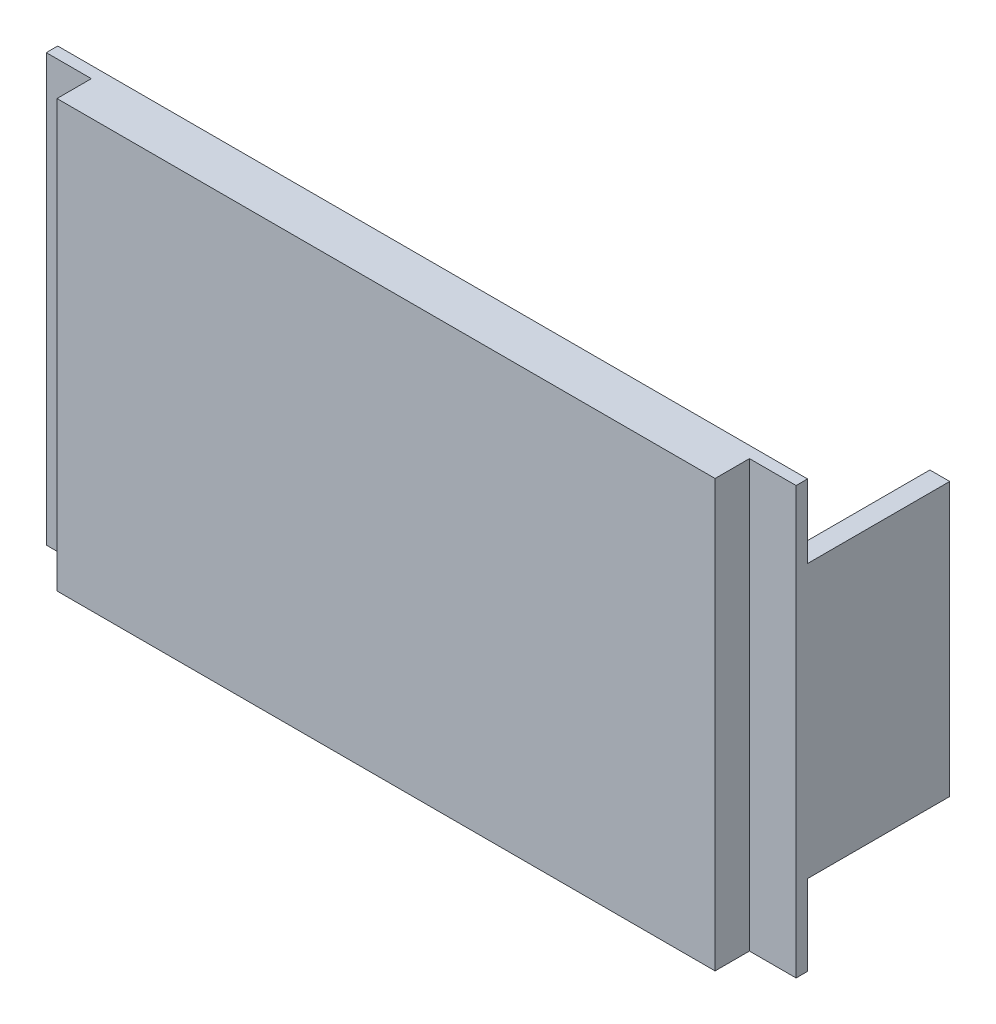
ISO-10303-21;
HEADER;
FILE_DESCRIPTION(('STEP AP214'),'2;1');
FILE_NAME('part.step','',(''),(''),'','','');
FILE_SCHEMA(('AUTOMOTIVE_DESIGN { 1 0 10303 214 1 1 1 1 }'));
ENDSEC;
DATA;
#1=APPLICATION_CONTEXT('core data for automotive mechanical design processes');
#2=APPLICATION_PROTOCOL_DEFINITION('international standard','automotive_design',2000,#1);
#3=PRODUCT_CONTEXT('',#1,'mechanical');
#4=PRODUCT('Part','Part','',(#3));
#5=PRODUCT_RELATED_PRODUCT_CATEGORY('part','',(#4));
#6=PRODUCT_DEFINITION_FORMATION('','',#4);
#7=PRODUCT_DEFINITION_CONTEXT('part definition',#1,'design');
#8=PRODUCT_DEFINITION('design','',#6,#7);
#9=PRODUCT_DEFINITION_SHAPE('','',#8);
#10=(LENGTH_UNIT() NAMED_UNIT(*) SI_UNIT(.MILLI.,.METRE.));
#11=(NAMED_UNIT(*) PLANE_ANGLE_UNIT() SI_UNIT($,.RADIAN.));
#12=(NAMED_UNIT(*) SI_UNIT($,.STERADIAN.) SOLID_ANGLE_UNIT());
#13=UNCERTAINTY_MEASURE_WITH_UNIT(LENGTH_MEASURE(1.E-05),#10,'distance_accuracy_value','');
#14=(GEOMETRIC_REPRESENTATION_CONTEXT(3) GLOBAL_UNCERTAINTY_ASSIGNED_CONTEXT((#13)) GLOBAL_UNIT_ASSIGNED_CONTEXT((#10,
#11,#12)) REPRESENTATION_CONTEXT('',''));
#15=CARTESIAN_POINT('',(0.,0.,0.));
#16=DIRECTION('',(0.,0.,1.));
#17=DIRECTION('',(1.,0.,0.));
#18=AXIS2_PLACEMENT_3D('',#15,#16,#17);
#19=CARTESIAN_POINT('',(0.,0.,0.));
#20=DIRECTION('',(0.,0.,-1.));
#21=DIRECTION('',(-1.,0.,0.));
#22=AXIS2_PLACEMENT_3D('',#19,#20,#21);
#23=PLANE('',#22);
#24=DIRECTION('',(-1.,0.,0.));
#25=VECTOR('',#24,1.);
#26=CARTESIAN_POINT('',(0.,-18.9488126975122,0.));
#27=LINE('',#26,#25);
#28=CARTESIAN_POINT('',(49.05,-18.9488126975122,0.));
#29=VERTEX_POINT('',#28);
#30=CARTESIAN_POINT('',(46.45,-18.9488126975122,0.));
#31=VERTEX_POINT('',#30);
#32=EDGE_CURVE('E209',#29,#31,#27,.T.);
#33=ORIENTED_EDGE('',*,*,#32,.F.);
#34=DIRECTION('',(0.,1.,0.));
#35=VECTOR('',#34,1.);
#36=CARTESIAN_POINT('',(49.05,-29.4610207100592,0.));
#37=LINE('',#36,#35);
#38=CARTESIAN_POINT('',(49.05,-29.4610207100592,0.));
#39=VERTEX_POINT('',#38);
#40=EDGE_CURVE('E271',#39,#29,#37,.T.);
#41=ORIENTED_EDGE('',*,*,#40,.F.);
#42=DIRECTION('',(1.,0.,0.));
#43=VECTOR('',#42,1.);
#44=CARTESIAN_POINT('',(-49.05,-29.4610207100592,0.));
#45=LINE('',#44,#43);
#46=CARTESIAN_POINT('',(-49.05,-29.4610207100592,0.));
#47=VERTEX_POINT('',#46);
#48=EDGE_CURVE('E267',#47,#39,#45,.T.);
#49=ORIENTED_EDGE('',*,*,#48,.F.);
#50=DIRECTION('',(0.,-1.,0.));
#51=VECTOR('',#50,1.);
#52=CARTESIAN_POINT('',(-49.05,-29.4610207100592,0.));
#53=LINE('',#52,#51);
#54=CARTESIAN_POINT('',(-49.05,26.3389792899408,0.));
#55=VERTEX_POINT('',#54);
#56=EDGE_CURVE('E277',#55,#47,#53,.T.);
#57=ORIENTED_EDGE('',*,*,#56,.F.);
#58=DIRECTION('',(-1.,0.,0.));
#59=VECTOR('',#58,1.);
#60=CARTESIAN_POINT('',(-49.05,26.3389792899408,0.));
#61=LINE('',#60,#59);
#62=CARTESIAN_POINT('',(49.05,26.3389792899408,0.));
#63=VERTEX_POINT('',#62);
#64=EDGE_CURVE('E274',#63,#55,#61,.T.);
#65=ORIENTED_EDGE('',*,*,#64,.F.);
#66=CARTESIAN_POINT('',(49.05,16.7511873024878,0.));
#67=VERTEX_POINT('',#66);
#68=EDGE_CURVE('E246',#67,#63,#37,.T.);
#69=ORIENTED_EDGE('',*,*,#68,.F.);
#70=DIRECTION('',(-1.,0.,0.));
#71=VECTOR('',#70,1.);
#72=CARTESIAN_POINT('',(0.,16.7511873024878,0.));
#73=LINE('',#72,#71);
#74=CARTESIAN_POINT('',(46.45,16.7511873024878,0.));
#75=VERTEX_POINT('',#74);
#76=EDGE_CURVE('E200',#67,#75,#73,.T.);
#77=ORIENTED_EDGE('',*,*,#76,.T.);
#78=DIRECTION('',(0.,-1.,0.));
#79=VECTOR('',#78,1.);
#80=CARTESIAN_POINT('',(46.45,0.,0.));
#81=LINE('',#80,#79);
#82=EDGE_CURVE('E84',#75,#31,#81,.T.);
#83=ORIENTED_EDGE('',*,*,#82,.T.);
#84=EDGE_LOOP('',(#33,#41,#49,#57,#65,#69,#77,#83));
#85=FACE_BOUND('',#84,.T.);
#86=DIRECTION('',(-1.,0.,0.));
#87=VECTOR('',#86,1.);
#88=CARTESIAN_POINT('',(4.84999999999999,-27.8610207100592,0.));
#89=LINE('',#88,#87);
#90=CARTESIAN_POINT('',(4.84999999999999,-27.8610207100592,0.));
#91=VERTEX_POINT('',#90);
#92=CARTESIAN_POINT('',(-9.95000000000001,-27.8610207100592,0.));
#93=VERTEX_POINT('',#92);
#94=EDGE_CURVE('E444',#91,#93,#89,.T.);
#95=ORIENTED_EDGE('',*,*,#94,.F.);
#96=DIRECTION('',(0.,-1.,0.));
#97=VECTOR('',#96,1.);
#98=CARTESIAN_POINT('',(4.84999999999999,-13.1610207100592,0.));
#99=LINE('',#98,#97);
#100=CARTESIAN_POINT('',(4.84999999999999,-13.1610207100592,0.));
#101=VERTEX_POINT('',#100);
#102=EDGE_CURVE('E197',#101,#91,#99,.T.);
#103=ORIENTED_EDGE('',*,*,#102,.F.);
#104=DIRECTION('',(1.,0.,0.));
#105=VECTOR('',#104,1.);
#106=CARTESIAN_POINT('',(4.84999999999999,-13.1610207100592,0.));
#107=LINE('',#106,#105);
#108=CARTESIAN_POINT('',(-9.95000000000001,-13.1610207100592,0.));
#109=VERTEX_POINT('',#108);
#110=EDGE_CURVE('E193',#109,#101,#107,.T.);
#111=ORIENTED_EDGE('',*,*,#110,.F.);
#112=DIRECTION('',(0.,1.,0.));
#113=VECTOR('',#112,1.);
#114=CARTESIAN_POINT('',(-9.95000000000001,-13.1610207100592,0.));
#115=LINE('',#114,#113);
#116=EDGE_CURVE('E441',#93,#109,#115,.T.);
#117=ORIENTED_EDGE('',*,*,#116,.F.);
#118=EDGE_LOOP('',(#95,#103,#111,#117));
#119=FACE_BOUND('',#118,.T.);
#120=ADVANCED_FACE('F61',(#85,#119),#23,.T.);
#121=CARTESIAN_POINT('',(-49.05,-29.4610207100592,6.));
#122=DIRECTION('',(1.,0.,0.));
#123=DIRECTION('',(0.,0.,-1.));
#124=AXIS2_PLACEMENT_3D('',#121,#122,#123);
#125=PLANE('',#124);
#126=DIRECTION('',(0.,-1.,0.));
#127=VECTOR('',#126,1.);
#128=CARTESIAN_POINT('',(-49.05,26.3389792899408,1.5));
#129=LINE('',#128,#127);
#130=CARTESIAN_POINT('',(-49.05,26.3389792899408,1.5));
#131=VERTEX_POINT('',#130);
#132=CARTESIAN_POINT('',(-49.05,-29.4610207100592,1.5));
#133=VERTEX_POINT('',#132);
#134=EDGE_CURVE('E229',#131,#133,#129,.T.);
#135=ORIENTED_EDGE('',*,*,#134,.F.);
#136=DIRECTION('',(0.,0.,-1.));
#137=VECTOR('',#136,1.);
#138=CARTESIAN_POINT('',(-49.05,26.3389792899408,6.));
#139=LINE('',#138,#137);
#140=EDGE_CURVE('E69',#131,#55,#139,.T.);
#141=ORIENTED_EDGE('',*,*,#140,.T.);
#142=ORIENTED_EDGE('',*,*,#56,.T.);
#143=DIRECTION('',(0.,0.,-1.));
#144=VECTOR('',#143,1.);
#145=CARTESIAN_POINT('',(-49.05,-29.4610207100592,6.));
#146=LINE('',#145,#144);
#147=EDGE_CURVE('E283',#133,#47,#146,.T.);
#148=ORIENTED_EDGE('',*,*,#147,.F.);
#149=EDGE_LOOP('',(#135,#141,#142,#148));
#150=FACE_BOUND('',#149,.T.);
#151=ADVANCED_FACE('F287',(#150),#125,.F.);
#152=CARTESIAN_POINT('',(49.05,-29.4610207100592,6.));
#153=DIRECTION('',(-1.,0.,0.));
#154=DIRECTION('',(0.,0.,1.));
#155=AXIS2_PLACEMENT_3D('',#152,#153,#154);
#156=PLANE('',#155);
#157=DIRECTION('',(0.,0.,-1.));
#158=VECTOR('',#157,1.);
#159=CARTESIAN_POINT('',(49.05,26.3389792899408,6.));
#160=LINE('',#159,#158);
#161=CARTESIAN_POINT('',(49.05,26.3389792899408,1.5));
#162=VERTEX_POINT('',#161);
#163=EDGE_CURVE('E13',#162,#63,#160,.T.);
#164=ORIENTED_EDGE('',*,*,#163,.F.);
#165=DIRECTION('',(0.,1.,0.));
#166=VECTOR('',#165,1.);
#167=CARTESIAN_POINT('',(49.05,26.3389792899408,1.5));
#168=LINE('',#167,#166);
#169=CARTESIAN_POINT('',(49.05,-29.4610207100592,1.5));
#170=VERTEX_POINT('',#169);
#171=EDGE_CURVE('E248',#170,#162,#168,.T.);
#172=ORIENTED_EDGE('',*,*,#171,.F.);
#173=DIRECTION('',(0.,0.,-1.));
#174=VECTOR('',#173,1.);
#175=CARTESIAN_POINT('',(49.05,-29.4610207100592,6.));
#176=LINE('',#175,#174);
#177=EDGE_CURVE('E270',#170,#39,#176,.T.);
#178=ORIENTED_EDGE('',*,*,#177,.T.);
#179=ORIENTED_EDGE('',*,*,#40,.T.);
#180=DIRECTION('',(0.,0.,1.));
#181=VECTOR('',#180,1.);
#182=CARTESIAN_POINT('',(49.05,-18.9488126975122,-18.6));
#183=LINE('',#182,#181);
#184=CARTESIAN_POINT('',(49.05,-18.9488126975122,-18.6));
#185=VERTEX_POINT('',#184);
#186=EDGE_CURVE('E222',#185,#29,#183,.T.);
#187=ORIENTED_EDGE('',*,*,#186,.F.);
#188=DIRECTION('',(0.,-1.,0.));
#189=VECTOR('',#188,1.);
#190=CARTESIAN_POINT('',(49.05,0.,-18.6));
#191=LINE('',#190,#189);
#192=CARTESIAN_POINT('',(49.05,16.7511873024878,-18.6));
#193=VERTEX_POINT('',#192);
#194=EDGE_CURVE('E212',#193,#185,#191,.T.);
#195=ORIENTED_EDGE('',*,*,#194,.F.);
#196=DIRECTION('',(0.,0.,1.));
#197=VECTOR('',#196,1.);
#198=CARTESIAN_POINT('',(49.05,16.7511873024878,-18.6));
#199=LINE('',#198,#197);
#200=EDGE_CURVE('E224',#193,#67,#199,.T.);
#201=ORIENTED_EDGE('',*,*,#200,.T.);
#202=ORIENTED_EDGE('',*,*,#68,.T.);
#203=EDGE_LOOP('',(#164,#172,#178,#179,#187,#195,#201,#202));
#204=FACE_BOUND('',#203,.T.);
#205=ADVANCED_FACE('F63',(#204),#156,.F.);
#206=CARTESIAN_POINT('',(-49.05,26.3389792899408,6.));
#207=DIRECTION('',(0.,-1.,0.));
#208=DIRECTION('',(0.,0.,-1.));
#209=AXIS2_PLACEMENT_3D('',#206,#207,#208);
#210=PLANE('',#209);
#211=DIRECTION('',(-1.,0.,0.));
#212=VECTOR('',#211,1.);
#213=CARTESIAN_POINT('',(-49.05,26.3389792899408,1.5));
#214=LINE('',#213,#212);
#215=CARTESIAN_POINT('',(-43.15,26.3389792899408,1.5));
#216=VERTEX_POINT('',#215);
#217=EDGE_CURVE('E238',#216,#131,#214,.T.);
#218=ORIENTED_EDGE('',*,*,#217,.F.);
#219=DIRECTION('',(0.,0.,1.));
#220=VECTOR('',#219,1.);
#221=CARTESIAN_POINT('',(-43.15,26.3389792899408,1.5));
#222=LINE('',#221,#220);
#223=CARTESIAN_POINT('',(-43.15,26.3389792899408,6.));
#224=VERTEX_POINT('',#223);
#225=EDGE_CURVE('E243',#216,#224,#222,.T.);
#226=ORIENTED_EDGE('',*,*,#225,.T.);
#227=DIRECTION('',(-1.,0.,0.));
#228=VECTOR('',#227,1.);
#229=CARTESIAN_POINT('',(-49.05,26.3389792899408,6.));
#230=LINE('',#229,#228);
#231=CARTESIAN_POINT('',(42.95,26.3389792899408,6.));
#232=VERTEX_POINT('',#231);
#233=EDGE_CURVE('E263',#232,#224,#230,.T.);
#234=ORIENTED_EDGE('',*,*,#233,.F.);
#235=DIRECTION('',(0.,0.,1.));
#236=VECTOR('',#235,1.);
#237=CARTESIAN_POINT('',(42.95,26.3389792899408,1.5));
#238=LINE('',#237,#236);
#239=CARTESIAN_POINT('',(42.95,26.3389792899408,1.5));
#240=VERTEX_POINT('',#239);
#241=EDGE_CURVE('E258',#240,#232,#238,.T.);
#242=ORIENTED_EDGE('',*,*,#241,.F.);
#243=DIRECTION('',(-1.,0.,0.));
#244=VECTOR('',#243,1.);
#245=CARTESIAN_POINT('',(49.05,26.3389792899408,1.5));
#246=LINE('',#245,#244);
#247=EDGE_CURVE('E250',#162,#240,#246,.T.);
#248=ORIENTED_EDGE('',*,*,#247,.F.);
#249=ORIENTED_EDGE('',*,*,#163,.T.);
#250=ORIENTED_EDGE('',*,*,#64,.T.);
#251=ORIENTED_EDGE('',*,*,#140,.F.);
#252=EDGE_LOOP('',(#218,#226,#234,#242,#248,#249,#250,#251));
#253=FACE_BOUND('',#252,.T.);
#254=ADVANCED_FACE('F294',(#253),#210,.F.);
#255=CARTESIAN_POINT('',(-49.05,-29.4610207100592,6.));
#256=DIRECTION('',(0.,1.,0.));
#257=DIRECTION('',(0.,0.,1.));
#258=AXIS2_PLACEMENT_3D('',#255,#256,#257);
#259=PLANE('',#258);
#260=DIRECTION('',(1.,0.,0.));
#261=VECTOR('',#260,1.);
#262=CARTESIAN_POINT('',(-49.05,-29.4610207100592,6.));
#263=LINE('',#262,#261);
#264=CARTESIAN_POINT('',(-43.15,-29.4610207100592,6.));
#265=VERTEX_POINT('',#264);
#266=CARTESIAN_POINT('',(42.95,-29.4610207100592,6.));
#267=VERTEX_POINT('',#266);
#268=EDGE_CURVE('E266',#265,#267,#263,.T.);
#269=ORIENTED_EDGE('',*,*,#268,.F.);
#270=DIRECTION('',(0.,0.,1.));
#271=VECTOR('',#270,1.);
#272=CARTESIAN_POINT('',(-43.15,-29.4610207100592,1.5));
#273=LINE('',#272,#271);
#274=CARTESIAN_POINT('',(-43.15,-29.4610207100592,1.5));
#275=VERTEX_POINT('',#274);
#276=EDGE_CURVE('E240',#275,#265,#273,.T.);
#277=ORIENTED_EDGE('',*,*,#276,.F.);
#278=DIRECTION('',(1.,0.,0.));
#279=VECTOR('',#278,1.);
#280=CARTESIAN_POINT('',(-49.05,-29.4610207100592,1.5));
#281=LINE('',#280,#279);
#282=EDGE_CURVE('E231',#133,#275,#281,.T.);
#283=ORIENTED_EDGE('',*,*,#282,.F.);
#284=ORIENTED_EDGE('',*,*,#147,.T.);
#285=ORIENTED_EDGE('',*,*,#48,.T.);
#286=ORIENTED_EDGE('',*,*,#177,.F.);
#287=DIRECTION('',(1.,0.,0.));
#288=VECTOR('',#287,1.);
#289=CARTESIAN_POINT('',(49.05,-29.4610207100592,1.5));
#290=LINE('',#289,#288);
#291=CARTESIAN_POINT('',(42.95,-29.4610207100592,1.5));
#292=VERTEX_POINT('',#291);
#293=EDGE_CURVE('E256',#292,#170,#290,.T.);
#294=ORIENTED_EDGE('',*,*,#293,.F.);
#295=DIRECTION('',(0.,0.,1.));
#296=VECTOR('',#295,1.);
#297=CARTESIAN_POINT('',(42.95,-29.4610207100592,1.5));
#298=LINE('',#297,#296);
#299=EDGE_CURVE('E242',#292,#267,#298,.T.);
#300=ORIENTED_EDGE('',*,*,#299,.T.);
#301=EDGE_LOOP('',(#269,#277,#283,#284,#285,#286,#294,#300));
#302=FACE_BOUND('',#301,.T.);
#303=ADVANCED_FACE('F305',(#302),#259,.F.);
#304=CARTESIAN_POINT('',(0.,0.,6.));
#305=DIRECTION('',(0.,0.,-1.));
#306=DIRECTION('',(-1.,0.,0.));
#307=AXIS2_PLACEMENT_3D('',#304,#305,#306);
#308=PLANE('',#307);
#309=ORIENTED_EDGE('',*,*,#233,.T.);
#310=DIRECTION('',(0.,1.,0.));
#311=VECTOR('',#310,1.);
#312=CARTESIAN_POINT('',(-43.15,26.3389792899408,6.));
#313=LINE('',#312,#311);
#314=EDGE_CURVE('E232',#265,#224,#313,.T.);
#315=ORIENTED_EDGE('',*,*,#314,.F.);
#316=ORIENTED_EDGE('',*,*,#268,.T.);
#317=DIRECTION('',(0.,-1.,0.));
#318=VECTOR('',#317,1.);
#319=CARTESIAN_POINT('',(42.95,26.3389792899408,6.));
#320=LINE('',#319,#318);
#321=EDGE_CURVE('E228',#232,#267,#320,.T.);
#322=ORIENTED_EDGE('',*,*,#321,.F.);
#323=EDGE_LOOP('',(#309,#315,#316,#322));
#324=FACE_BOUND('',#323,.T.);
#325=ADVANCED_FACE('F317',(#324),#308,.F.);
#326=CARTESIAN_POINT('',(42.95,26.3389792899408,1.5));
#327=DIRECTION('',(-1.,0.,0.));
#328=DIRECTION('',(0.,-1.,0.));
#329=AXIS2_PLACEMENT_3D('',#326,#327,#328);
#330=PLANE('',#329);
#331=ORIENTED_EDGE('',*,*,#321,.T.);
#332=ORIENTED_EDGE('',*,*,#299,.F.);
#333=DIRECTION('',(0.,-1.,0.));
#334=VECTOR('',#333,1.);
#335=CARTESIAN_POINT('',(42.95,26.3389792899408,1.5));
#336=LINE('',#335,#334);
#337=EDGE_CURVE('E253',#240,#292,#336,.T.);
#338=ORIENTED_EDGE('',*,*,#337,.F.);
#339=ORIENTED_EDGE('',*,*,#241,.T.);
#340=EDGE_LOOP('',(#331,#332,#338,#339));
#341=FACE_BOUND('',#340,.T.);
#342=ADVANCED_FACE('F319',(#341),#330,.F.);
#343=CARTESIAN_POINT('',(0.,0.,1.5));
#344=DIRECTION('',(0.,0.,-1.));
#345=DIRECTION('',(-1.,0.,0.));
#346=AXIS2_PLACEMENT_3D('',#343,#344,#345);
#347=PLANE('',#346);
#348=ORIENTED_EDGE('',*,*,#171,.T.);
#349=ORIENTED_EDGE('',*,*,#247,.T.);
#350=ORIENTED_EDGE('',*,*,#337,.T.);
#351=ORIENTED_EDGE('',*,*,#293,.T.);
#352=EDGE_LOOP('',(#348,#349,#350,#351));
#353=FACE_BOUND('',#352,.T.);
#354=ADVANCED_FACE('F322',(#353),#347,.F.);
#355=CARTESIAN_POINT('',(-43.15,26.3389792899408,1.5));
#356=DIRECTION('',(1.,0.,0.));
#357=DIRECTION('',(0.,1.,0.));
#358=AXIS2_PLACEMENT_3D('',#355,#356,#357);
#359=PLANE('',#358);
#360=ORIENTED_EDGE('',*,*,#314,.T.);
#361=ORIENTED_EDGE('',*,*,#225,.F.);
#362=DIRECTION('',(0.,1.,0.));
#363=VECTOR('',#362,1.);
#364=CARTESIAN_POINT('',(-43.15,26.3389792899408,1.5));
#365=LINE('',#364,#363);
#366=EDGE_CURVE('E235',#275,#216,#365,.T.);
#367=ORIENTED_EDGE('',*,*,#366,.F.);
#368=ORIENTED_EDGE('',*,*,#276,.T.);
#369=EDGE_LOOP('',(#360,#361,#367,#368));
#370=FACE_BOUND('',#369,.T.);
#371=ADVANCED_FACE('F478',(#370),#359,.F.);
#372=CARTESIAN_POINT('',(0.,0.,1.5));
#373=DIRECTION('',(0.,0.,1.));
#374=DIRECTION('',(1.,0.,0.));
#375=AXIS2_PLACEMENT_3D('',#372,#373,#374);
#376=PLANE('',#375);
#377=ORIENTED_EDGE('',*,*,#134,.T.);
#378=ORIENTED_EDGE('',*,*,#282,.T.);
#379=ORIENTED_EDGE('',*,*,#366,.T.);
#380=ORIENTED_EDGE('',*,*,#217,.T.);
#381=EDGE_LOOP('',(#377,#378,#379,#380));
#382=FACE_BOUND('',#381,.T.);
#383=ADVANCED_FACE('F310',(#382),#376,.T.);
#384=CARTESIAN_POINT('',(0.,16.7511873024878,-18.6));
#385=DIRECTION('',(0.,1.,0.));
#386=DIRECTION('',(0.,0.,1.));
#387=AXIS2_PLACEMENT_3D('',#384,#385,#386);
#388=PLANE('',#387);
#389=ORIENTED_EDGE('',*,*,#76,.F.);
#390=ORIENTED_EDGE('',*,*,#200,.F.);
#391=DIRECTION('',(-1.,0.,0.));
#392=VECTOR('',#391,1.);
#393=CARTESIAN_POINT('',(0.,16.7511873024878,-18.6));
#394=LINE('',#393,#392);
#395=CARTESIAN_POINT('',(46.45,16.7511873024878,-18.6));
#396=VERTEX_POINT('',#395);
#397=EDGE_CURVE('E208',#193,#396,#394,.T.);
#398=ORIENTED_EDGE('',*,*,#397,.T.);
#399=DIRECTION('',(0.,0.,1.));
#400=VECTOR('',#399,1.);
#401=CARTESIAN_POINT('',(46.45,16.7511873024878,-18.6));
#402=LINE('',#401,#400);
#403=EDGE_CURVE('E226',#396,#75,#402,.T.);
#404=ORIENTED_EDGE('',*,*,#403,.T.);
#405=EDGE_LOOP('',(#389,#390,#398,#404));
#406=FACE_BOUND('',#405,.T.);
#407=ADVANCED_FACE('F327',(#406),#388,.T.);
#408=CARTESIAN_POINT('',(46.45,0.,-18.6));
#409=DIRECTION('',(-1.,0.,0.));
#410=DIRECTION('',(0.,0.,1.));
#411=AXIS2_PLACEMENT_3D('',#408,#409,#410);
#412=PLANE('',#411);
#413=ORIENTED_EDGE('',*,*,#82,.F.);
#414=ORIENTED_EDGE('',*,*,#403,.F.);
#415=DIRECTION('',(0.,-1.,0.));
#416=VECTOR('',#415,1.);
#417=CARTESIAN_POINT('',(46.45,0.,-18.6));
#418=LINE('',#417,#416);
#419=CARTESIAN_POINT('',(46.45,-18.9488126975122,-18.6));
#420=VERTEX_POINT('',#419);
#421=EDGE_CURVE('E205',#396,#420,#418,.T.);
#422=ORIENTED_EDGE('',*,*,#421,.T.);
#423=DIRECTION('',(0.,0.,1.));
#424=VECTOR('',#423,1.);
#425=CARTESIAN_POINT('',(46.45,-18.9488126975122,-18.6));
#426=LINE('',#425,#424);
#427=EDGE_CURVE('E215',#420,#31,#426,.T.);
#428=ORIENTED_EDGE('',*,*,#427,.T.);
#429=EDGE_LOOP('',(#413,#414,#422,#428));
#430=FACE_BOUND('',#429,.T.);
#431=ADVANCED_FACE('F330',(#430),#412,.T.);
#432=CARTESIAN_POINT('',(0.,-18.9488126975122,-18.6));
#433=DIRECTION('',(0.,1.,0.));
#434=DIRECTION('',(0.,0.,1.));
#435=AXIS2_PLACEMENT_3D('',#432,#433,#434);
#436=PLANE('',#435);
#437=ORIENTED_EDGE('',*,*,#32,.T.);
#438=ORIENTED_EDGE('',*,*,#427,.F.);
#439=DIRECTION('',(-1.,0.,0.));
#440=VECTOR('',#439,1.);
#441=CARTESIAN_POINT('',(0.,-18.9488126975122,-18.6));
#442=LINE('',#441,#440);
#443=EDGE_CURVE('E214',#185,#420,#442,.T.);
#444=ORIENTED_EDGE('',*,*,#443,.F.);
#445=ORIENTED_EDGE('',*,*,#186,.T.);
#446=EDGE_LOOP('',(#437,#438,#444,#445));
#447=FACE_BOUND('',#446,.T.);
#448=ADVANCED_FACE('F337',(#447),#436,.F.);
#449=CARTESIAN_POINT('',(0.,0.,-18.6));
#450=DIRECTION('',(0.,0.,-1.));
#451=DIRECTION('',(-1.,0.,0.));
#452=AXIS2_PLACEMENT_3D('',#449,#450,#451);
#453=PLANE('',#452);
#454=ORIENTED_EDGE('',*,*,#421,.F.);
#455=ORIENTED_EDGE('',*,*,#397,.F.);
#456=ORIENTED_EDGE('',*,*,#194,.T.);
#457=ORIENTED_EDGE('',*,*,#443,.T.);
#458=EDGE_LOOP('',(#454,#455,#456,#457));
#459=FACE_BOUND('',#458,.T.);
#460=ADVANCED_FACE('F332',(#459),#453,.T.);
#461=CARTESIAN_POINT('',(4.84999999999999,-13.1610207100592,-2.2));
#462=DIRECTION('',(-1.,0.,0.));
#463=DIRECTION('',(0.,0.,1.));
#464=AXIS2_PLACEMENT_3D('',#461,#462,#463);
#465=PLANE('',#464);
#466=ORIENTED_EDGE('',*,*,#102,.T.);
#467=DIRECTION('',(0.,0.,1.));
#468=VECTOR('',#467,1.);
#469=CARTESIAN_POINT('',(4.84999999999999,-27.8610207100592,-2.2));
#470=LINE('',#469,#468);
#471=CARTESIAN_POINT('',(4.84999999999999,-27.8610207100592,-2.2));
#472=VERTEX_POINT('',#471);
#473=EDGE_CURVE('E178',#472,#91,#470,.T.);
#474=ORIENTED_EDGE('',*,*,#473,.F.);
#475=DIRECTION('',(0.,-1.,0.));
#476=VECTOR('',#475,1.);
#477=CARTESIAN_POINT('',(4.84999999999999,-13.1610207100592,-2.2));
#478=LINE('',#477,#476);
#479=CARTESIAN_POINT('',(4.84999999999999,-13.1610207100592,-2.2));
#480=VERTEX_POINT('',#479);
#481=EDGE_CURVE('E185',#480,#472,#478,.T.);
#482=ORIENTED_EDGE('',*,*,#481,.F.);
#483=DIRECTION('',(0.,0.,1.));
#484=VECTOR('',#483,1.);
#485=CARTESIAN_POINT('',(4.84999999999999,-13.1610207100592,-2.2));
#486=LINE('',#485,#484);
#487=EDGE_CURVE('E439',#480,#101,#486,.T.);
#488=ORIENTED_EDGE('',*,*,#487,.T.);
#489=EDGE_LOOP('',(#466,#474,#482,#488));
#490=FACE_BOUND('',#489,.T.);
#491=ADVANCED_FACE('F195',(#490),#465,.F.);
#492=CARTESIAN_POINT('',(4.84999999999999,-27.8610207100592,-2.2));
#493=DIRECTION('',(0.,1.,0.));
#494=DIRECTION('',(0.,0.,1.));
#495=AXIS2_PLACEMENT_3D('',#492,#493,#494);
#496=PLANE('',#495);
#497=ORIENTED_EDGE('',*,*,#94,.T.);
#498=DIRECTION('',(0.,0.,1.));
#499=VECTOR('',#498,1.);
#500=CARTESIAN_POINT('',(-9.95000000000001,-27.8610207100592,-2.2));
#501=LINE('',#500,#499);
#502=CARTESIAN_POINT('',(-9.95000000000001,-27.8610207100592,-2.2));
#503=VERTEX_POINT('',#502);
#504=EDGE_CURVE('E181',#503,#93,#501,.T.);
#505=ORIENTED_EDGE('',*,*,#504,.F.);
#506=DIRECTION('',(-1.,0.,0.));
#507=VECTOR('',#506,1.);
#508=CARTESIAN_POINT('',(4.84999999999999,-27.8610207100592,-2.2));
#509=LINE('',#508,#507);
#510=EDGE_CURVE('E174',#472,#503,#509,.T.);
#511=ORIENTED_EDGE('',*,*,#510,.F.);
#512=ORIENTED_EDGE('',*,*,#473,.T.);
#513=EDGE_LOOP('',(#497,#505,#511,#512));
#514=FACE_BOUND('',#513,.T.);
#515=ADVANCED_FACE('F176',(#514),#496,.F.);
#516=CARTESIAN_POINT('',(-9.95000000000001,-13.1610207100592,-2.2));
#517=DIRECTION('',(1.,0.,0.));
#518=DIRECTION('',(0.,1.,0.));
#519=AXIS2_PLACEMENT_3D('',#516,#517,#518);
#520=PLANE('',#519);
#521=ORIENTED_EDGE('',*,*,#116,.T.);
#522=DIRECTION('',(0.,0.,1.));
#523=VECTOR('',#522,1.);
#524=CARTESIAN_POINT('',(-9.95000000000001,-13.1610207100592,-2.2));
#525=LINE('',#524,#523);
#526=CARTESIAN_POINT('',(-9.95000000000001,-13.1610207100592,-2.2));
#527=VERTEX_POINT('',#526);
#528=EDGE_CURVE('E76',#527,#109,#525,.T.);
#529=ORIENTED_EDGE('',*,*,#528,.F.);
#530=DIRECTION('',(0.,1.,0.));
#531=VECTOR('',#530,1.);
#532=CARTESIAN_POINT('',(-9.95000000000001,-13.1610207100592,-2.2));
#533=LINE('',#532,#531);
#534=EDGE_CURVE('E184',#503,#527,#533,.T.);
#535=ORIENTED_EDGE('',*,*,#534,.F.);
#536=ORIENTED_EDGE('',*,*,#504,.T.);
#537=EDGE_LOOP('',(#521,#529,#535,#536));
#538=FACE_BOUND('',#537,.T.);
#539=ADVANCED_FACE('F403',(#538),#520,.F.);
#540=CARTESIAN_POINT('',(4.84999999999999,-13.1610207100592,-2.2));
#541=DIRECTION('',(0.,-1.,0.));
#542=DIRECTION('',(0.,0.,-1.));
#543=AXIS2_PLACEMENT_3D('',#540,#541,#542);
#544=PLANE('',#543);
#545=ORIENTED_EDGE('',*,*,#110,.T.);
#546=ORIENTED_EDGE('',*,*,#487,.F.);
#547=DIRECTION('',(1.,0.,0.));
#548=VECTOR('',#547,1.);
#549=CARTESIAN_POINT('',(4.84999999999999,-13.1610207100592,-2.2));
#550=LINE('',#549,#548);
#551=EDGE_CURVE('E189',#527,#480,#550,.T.);
#552=ORIENTED_EDGE('',*,*,#551,.F.);
#553=ORIENTED_EDGE('',*,*,#528,.T.);
#554=EDGE_LOOP('',(#545,#546,#552,#553));
#555=FACE_BOUND('',#554,.T.);
#556=ADVANCED_FACE('F410',(#555),#544,.F.);
#557=CARTESIAN_POINT('',(0.,0.,-2.2));
#558=DIRECTION('',(0.,0.,-1.));
#559=DIRECTION('',(-1.,0.,0.));
#560=AXIS2_PLACEMENT_3D('',#557,#558,#559);
#561=PLANE('',#560);
#562=ORIENTED_EDGE('',*,*,#481,.T.);
#563=ORIENTED_EDGE('',*,*,#510,.T.);
#564=ORIENTED_EDGE('',*,*,#534,.T.);
#565=ORIENTED_EDGE('',*,*,#551,.T.);
#566=EDGE_LOOP('',(#562,#563,#564,#565));
#567=FACE_BOUND('',#566,.T.);
#568=ADVANCED_FACE('F188',(#567),#561,.T.);
#569=CLOSED_SHELL('',(#120,#151,#205,#254,#303,#325,#342,#354,#371,#383,#407,#431,#448,#460,
#491,#515,#539,#556,#568));
#570=MANIFOLD_SOLID_BREP('B2',#569);
#571=ADVANCED_BREP_SHAPE_REPRESENTATION('',(#18,#570),#14);
#572=SHAPE_DEFINITION_REPRESENTATION(#9,#571);
ENDSEC;
END-ISO-10303-21;
